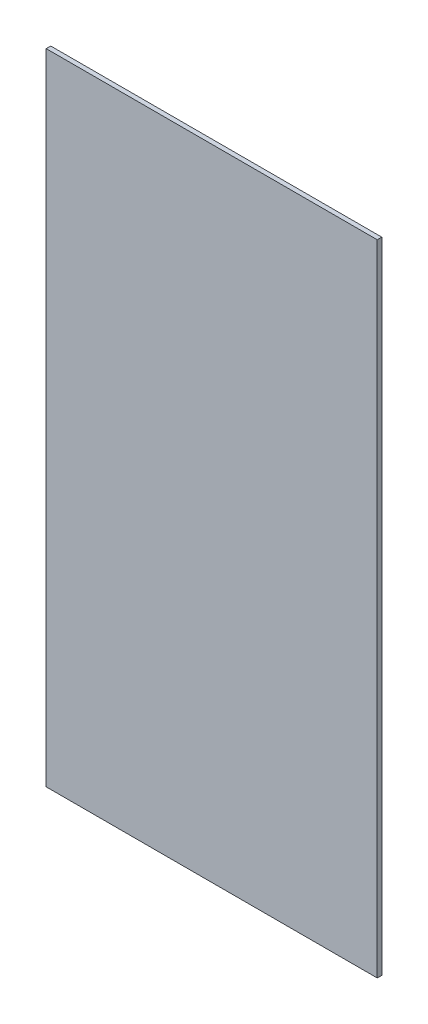
ISO-10303-21;
HEADER;
FILE_DESCRIPTION(('STEP AP214'),'2;1');
FILE_NAME('part.step','',(''),(''),'','','');
FILE_SCHEMA(('AUTOMOTIVE_DESIGN { 1 0 10303 214 1 1 1 1 }'));
ENDSEC;
DATA;
#1=APPLICATION_CONTEXT('core data for automotive mechanical design processes');
#2=APPLICATION_PROTOCOL_DEFINITION('international standard','automotive_design',2000,#1);
#3=PRODUCT_CONTEXT('',#1,'mechanical');
#4=PRODUCT('Part','Part','',(#3));
#5=PRODUCT_RELATED_PRODUCT_CATEGORY('part','',(#4));
#6=PRODUCT_DEFINITION_FORMATION('','',#4);
#7=PRODUCT_DEFINITION_CONTEXT('part definition',#1,'design');
#8=PRODUCT_DEFINITION('design','',#6,#7);
#9=PRODUCT_DEFINITION_SHAPE('','',#8);
#10=(LENGTH_UNIT() NAMED_UNIT(*) SI_UNIT(.MILLI.,.METRE.));
#11=(NAMED_UNIT(*) PLANE_ANGLE_UNIT() SI_UNIT($,.RADIAN.));
#12=(NAMED_UNIT(*) SI_UNIT($,.STERADIAN.) SOLID_ANGLE_UNIT());
#13=UNCERTAINTY_MEASURE_WITH_UNIT(LENGTH_MEASURE(1.E-05),#10,'distance_accuracy_value','');
#14=(GEOMETRIC_REPRESENTATION_CONTEXT(3) GLOBAL_UNCERTAINTY_ASSIGNED_CONTEXT((#13)) GLOBAL_UNIT_ASSIGNED_CONTEXT((#10,
#11,#12)) REPRESENTATION_CONTEXT('',''));
#15=CARTESIAN_POINT('',(0.,0.,0.));
#16=DIRECTION('',(0.,0.,1.));
#17=DIRECTION('',(1.,0.,0.));
#18=AXIS2_PLACEMENT_3D('',#15,#16,#17);
#19=CARTESIAN_POINT('',(-54.5,213.,8.));
#20=DIRECTION('',(-1.,0.,0.));
#21=DIRECTION('',(0.,0.,1.));
#22=AXIS2_PLACEMENT_3D('',#19,#20,#21);
#23=PLANE('',#22);
#24=DIRECTION('',(0.,0.,-1.));
#25=VECTOR('',#24,1.);
#26=CARTESIAN_POINT('',(-54.5,2.5,8.));
#27=LINE('',#26,#25);
#28=CARTESIAN_POINT('',(-54.5,2.5,8.));
#29=VERTEX_POINT('',#28);
#30=CARTESIAN_POINT('',(-54.5,2.5,6.5));
#31=VERTEX_POINT('',#30);
#32=EDGE_CURVE('E90',#29,#31,#27,.T.);
#33=ORIENTED_EDGE('',*,*,#32,.F.);
#34=DIRECTION('',(0.,-1.,0.));
#35=VECTOR('',#34,1.);
#36=CARTESIAN_POINT('',(-54.5,213.,8.));
#37=LINE('',#36,#35);
#38=CARTESIAN_POINT('',(-54.5,213.,8.));
#39=VERTEX_POINT('',#38);
#40=EDGE_CURVE('E19',#29,#39,#37,.F.);
#41=ORIENTED_EDGE('',*,*,#40,.T.);
#42=DIRECTION('',(0.,0.,-1.));
#43=VECTOR('',#42,1.);
#44=CARTESIAN_POINT('',(-54.5,213.,8.));
#45=LINE('',#44,#43);
#46=CARTESIAN_POINT('',(-54.5,213.,6.5));
#47=VERTEX_POINT('',#46);
#48=EDGE_CURVE('E70',#39,#47,#45,.T.);
#49=ORIENTED_EDGE('',*,*,#48,.T.);
#50=DIRECTION('',(0.,-1.,0.));
#51=VECTOR('',#50,1.);
#52=CARTESIAN_POINT('',(-54.5,213.,6.5));
#53=LINE('',#52,#51);
#54=EDGE_CURVE('E11',#31,#47,#53,.F.);
#55=ORIENTED_EDGE('',*,*,#54,.F.);
#56=EDGE_LOOP('',(#33,#41,#49,#55));
#57=FACE_BOUND('',#56,.T.);
#58=ADVANCED_FACE('F16',(#57),#23,.T.);
#59=CARTESIAN_POINT('',(-54.5,213.,6.5));
#60=DIRECTION('',(0.,0.,-1.));
#61=DIRECTION('',(-1.,0.,0.));
#62=AXIS2_PLACEMENT_3D('',#59,#60,#61);
#63=PLANE('',#62);
#64=DIRECTION('',(1.,0.,0.));
#65=VECTOR('',#64,1.);
#66=CARTESIAN_POINT('',(-54.5,2.5,6.5));
#67=LINE('',#66,#65);
#68=CARTESIAN_POINT('',(54.5,2.5,6.5));
#69=VERTEX_POINT('',#68);
#70=EDGE_CURVE('E64',#31,#69,#67,.T.);
#71=ORIENTED_EDGE('',*,*,#70,.F.);
#72=ORIENTED_EDGE('',*,*,#54,.T.);
#73=DIRECTION('',(1.,0.,0.));
#74=VECTOR('',#73,1.);
#75=CARTESIAN_POINT('',(-54.5,213.,6.5));
#76=LINE('',#75,#74);
#77=CARTESIAN_POINT('',(54.5,213.,6.5));
#78=VERTEX_POINT('',#77);
#79=EDGE_CURVE('E61',#47,#78,#76,.T.);
#80=ORIENTED_EDGE('',*,*,#79,.T.);
#81=DIRECTION('',(0.,-1.,0.));
#82=VECTOR('',#81,1.);
#83=CARTESIAN_POINT('',(54.5,213.,6.5));
#84=LINE('',#83,#82);
#85=EDGE_CURVE('E26',#69,#78,#84,.F.);
#86=ORIENTED_EDGE('',*,*,#85,.F.);
#87=EDGE_LOOP('',(#71,#72,#80,#86));
#88=FACE_BOUND('',#87,.T.);
#89=ADVANCED_FACE('F60',(#88),#63,.T.);
#90=CARTESIAN_POINT('',(54.5,213.,6.5));
#91=DIRECTION('',(1.,0.,0.));
#92=DIRECTION('',(0.,0.,-1.));
#93=AXIS2_PLACEMENT_3D('',#90,#91,#92);
#94=PLANE('',#93);
#95=DIRECTION('',(0.,0.,1.));
#96=VECTOR('',#95,1.);
#97=CARTESIAN_POINT('',(54.5,2.5,6.5));
#98=LINE('',#97,#96);
#99=CARTESIAN_POINT('',(54.5,2.5,8.));
#100=VERTEX_POINT('',#99);
#101=EDGE_CURVE('E82',#69,#100,#98,.T.);
#102=ORIENTED_EDGE('',*,*,#101,.F.);
#103=ORIENTED_EDGE('',*,*,#85,.T.);
#104=DIRECTION('',(0.,0.,1.));
#105=VECTOR('',#104,1.);
#106=CARTESIAN_POINT('',(54.5,213.,6.5));
#107=LINE('',#106,#105);
#108=CARTESIAN_POINT('',(54.5,213.,8.));
#109=VERTEX_POINT('',#108);
#110=EDGE_CURVE('E71',#78,#109,#107,.T.);
#111=ORIENTED_EDGE('',*,*,#110,.T.);
#112=DIRECTION('',(0.,-1.,0.));
#113=VECTOR('',#112,1.);
#114=CARTESIAN_POINT('',(54.5,213.,8.));
#115=LINE('',#114,#113);
#116=EDGE_CURVE('E34',#100,#109,#115,.F.);
#117=ORIENTED_EDGE('',*,*,#116,.F.);
#118=EDGE_LOOP('',(#102,#103,#111,#117));
#119=FACE_BOUND('',#118,.T.);
#120=ADVANCED_FACE('F102',(#119),#94,.T.);
#121=CARTESIAN_POINT('',(54.5,213.,8.));
#122=DIRECTION('',(0.,0.,1.));
#123=DIRECTION('',(1.,0.,0.));
#124=AXIS2_PLACEMENT_3D('',#121,#122,#123);
#125=PLANE('',#124);
#126=DIRECTION('',(-1.,0.,0.));
#127=VECTOR('',#126,1.);
#128=CARTESIAN_POINT('',(54.5,2.5,8.));
#129=LINE('',#128,#127);
#130=EDGE_CURVE('E75',#100,#29,#129,.T.);
#131=ORIENTED_EDGE('',*,*,#130,.F.);
#132=ORIENTED_EDGE('',*,*,#116,.T.);
#133=DIRECTION('',(-1.,0.,0.));
#134=VECTOR('',#133,1.);
#135=CARTESIAN_POINT('',(54.5,213.,8.));
#136=LINE('',#135,#134);
#137=EDGE_CURVE('E87',#109,#39,#136,.T.);
#138=ORIENTED_EDGE('',*,*,#137,.T.);
#139=ORIENTED_EDGE('',*,*,#40,.F.);
#140=EDGE_LOOP('',(#131,#132,#138,#139));
#141=FACE_BOUND('',#140,.T.);
#142=ADVANCED_FACE('F105',(#141),#125,.T.);
#143=CARTESIAN_POINT('',(0.,213.,0.));
#144=DIRECTION('',(0.,-1.,0.));
#145=DIRECTION('',(0.,0.,-1.));
#146=AXIS2_PLACEMENT_3D('',#143,#144,#145);
#147=PLANE('',#146);
#148=ORIENTED_EDGE('',*,*,#48,.F.);
#149=ORIENTED_EDGE('',*,*,#137,.F.);
#150=ORIENTED_EDGE('',*,*,#110,.F.);
#151=ORIENTED_EDGE('',*,*,#79,.F.);
#152=EDGE_LOOP('',(#148,#149,#150,#151));
#153=FACE_BOUND('',#152,.T.);
#154=ADVANCED_FACE('F68',(#153),#147,.F.);
#155=CARTESIAN_POINT('',(0.,2.5,0.));
#156=DIRECTION('',(0.,-1.,0.));
#157=DIRECTION('',(0.,0.,-1.));
#158=AXIS2_PLACEMENT_3D('',#155,#156,#157);
#159=PLANE('',#158);
#160=ORIENTED_EDGE('',*,*,#32,.T.);
#161=ORIENTED_EDGE('',*,*,#70,.T.);
#162=ORIENTED_EDGE('',*,*,#101,.T.);
#163=ORIENTED_EDGE('',*,*,#130,.T.);
#164=EDGE_LOOP('',(#160,#161,#162,#163));
#165=FACE_BOUND('',#164,.T.);
#166=ADVANCED_FACE('F104',(#165),#159,.T.);
#167=CLOSED_SHELL('',(#58,#89,#120,#142,#154,#166));
#168=MANIFOLD_SOLID_BREP('B1',#167);
#169=ADVANCED_BREP_SHAPE_REPRESENTATION('',(#18,#168),#14);
#170=SHAPE_DEFINITION_REPRESENTATION(#9,#169);
ENDSEC;
END-ISO-10303-21;
